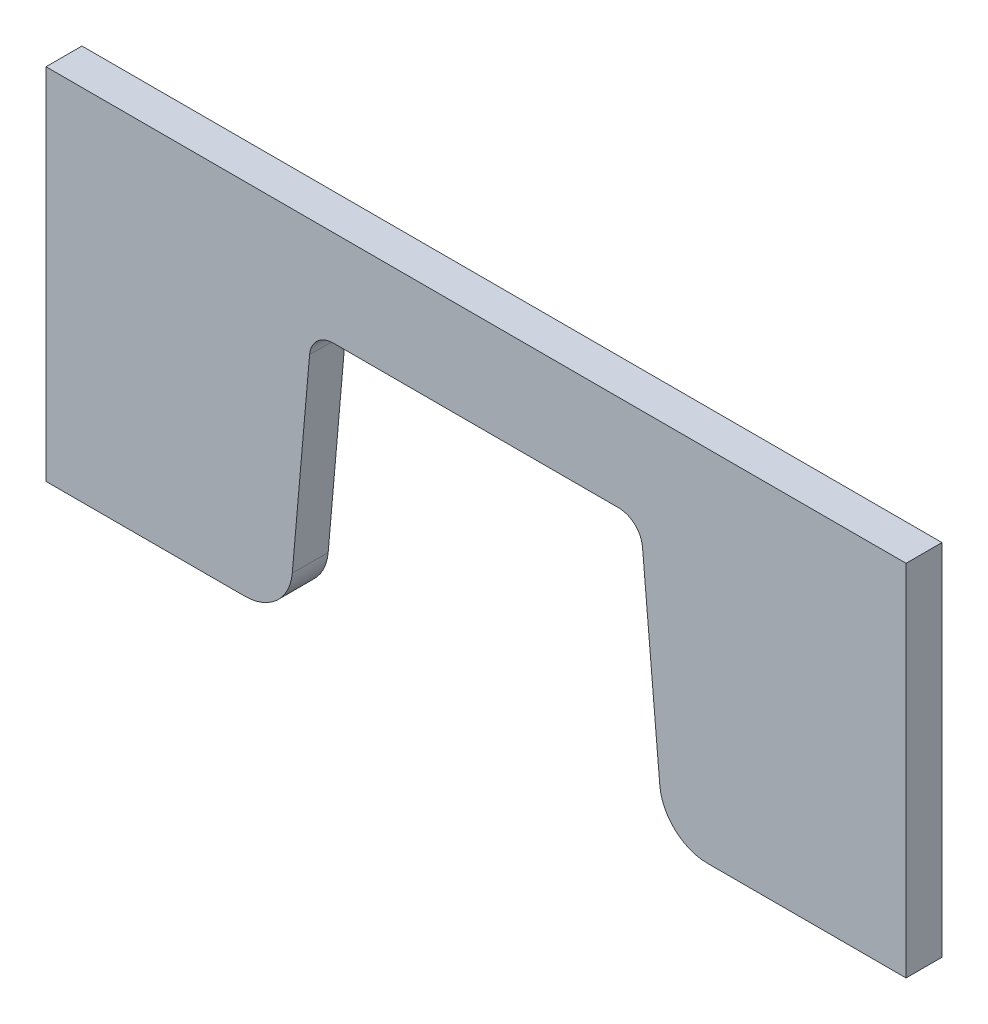
ISO-10303-21;
HEADER;
FILE_DESCRIPTION(('STEP AP214'),'2;1');
FILE_NAME('part.step','',(''),(''),'','','');
FILE_SCHEMA(('AUTOMOTIVE_DESIGN { 1 0 10303 214 1 1 1 1 }'));
ENDSEC;
DATA;
#1=APPLICATION_CONTEXT('core data for automotive mechanical design processes');
#2=APPLICATION_PROTOCOL_DEFINITION('international standard','automotive_design',2000,#1);
#3=PRODUCT_CONTEXT('',#1,'mechanical');
#4=PRODUCT('Part','Part','',(#3));
#5=PRODUCT_RELATED_PRODUCT_CATEGORY('part','',(#4));
#6=PRODUCT_DEFINITION_FORMATION('','',#4);
#7=PRODUCT_DEFINITION_CONTEXT('part definition',#1,'design');
#8=PRODUCT_DEFINITION('design','',#6,#7);
#9=PRODUCT_DEFINITION_SHAPE('','',#8);
#10=(LENGTH_UNIT() NAMED_UNIT(*) SI_UNIT(.MILLI.,.METRE.));
#11=(NAMED_UNIT(*) PLANE_ANGLE_UNIT() SI_UNIT($,.RADIAN.));
#12=(NAMED_UNIT(*) SI_UNIT($,.STERADIAN.) SOLID_ANGLE_UNIT());
#13=UNCERTAINTY_MEASURE_WITH_UNIT(LENGTH_MEASURE(1.E-05),#10,'distance_accuracy_value','');
#14=(GEOMETRIC_REPRESENTATION_CONTEXT(3) GLOBAL_UNCERTAINTY_ASSIGNED_CONTEXT((#13)) GLOBAL_UNIT_ASSIGNED_CONTEXT((#10,
#11,#12)) REPRESENTATION_CONTEXT('',''));
#15=CARTESIAN_POINT('',(0.,0.,0.));
#16=DIRECTION('',(0.,0.,1.));
#17=DIRECTION('',(1.,0.,0.));
#18=AXIS2_PLACEMENT_3D('',#15,#16,#17);
#19=CARTESIAN_POINT('',(-228.088766336441,-273.05,19.05));
#20=DIRECTION('',(1.,0.,0.));
#21=DIRECTION('',(0.,1.,0.));
#22=AXIS2_PLACEMENT_3D('',#19,#20,#21);
#23=PLANE('',#22);
#24=DIRECTION('',(0.,-1.,0.));
#25=VECTOR('',#24,1.);
#26=CARTESIAN_POINT('',(-228.088766336441,-273.05,0.));
#27=LINE('',#26,#25);
#28=CARTESIAN_POINT('',(-228.088766336441,-273.05,0.));
#29=VERTEX_POINT('',#28);
#30=CARTESIAN_POINT('',(-228.088766336441,-463.55,0.));
#31=VERTEX_POINT('',#30);
#32=EDGE_CURVE('E152',#29,#31,#27,.T.);
#33=ORIENTED_EDGE('',*,*,#32,.T.);
#34=DIRECTION('',(0.,0.,-1.));
#35=VECTOR('',#34,1.);
#36=CARTESIAN_POINT('',(-228.088766336441,-463.55,19.05));
#37=LINE('',#36,#35);
#38=CARTESIAN_POINT('',(-228.088766336441,-463.55,19.05));
#39=VERTEX_POINT('',#38);
#40=EDGE_CURVE('E11',#39,#31,#37,.T.);
#41=ORIENTED_EDGE('',*,*,#40,.F.);
#42=DIRECTION('',(0.,-1.,0.));
#43=VECTOR('',#42,1.);
#44=CARTESIAN_POINT('',(-228.088766336441,-273.05,19.05));
#45=LINE('',#44,#43);
#46=CARTESIAN_POINT('',(-228.088766336441,-273.05,19.05));
#47=VERTEX_POINT('',#46);
#48=EDGE_CURVE('E178',#47,#39,#45,.T.);
#49=ORIENTED_EDGE('',*,*,#48,.F.);
#50=DIRECTION('',(0.,0.,-1.));
#51=VECTOR('',#50,1.);
#52=CARTESIAN_POINT('',(-228.088766336441,-273.05,19.05));
#53=LINE('',#52,#51);
#54=EDGE_CURVE('E148',#47,#29,#53,.T.);
#55=ORIENTED_EDGE('',*,*,#54,.T.);
#56=EDGE_LOOP('',(#33,#41,#49,#55));
#57=FACE_BOUND('',#56,.T.);
#58=ADVANCED_FACE('F33',(#57),#23,.F.);
#59=CARTESIAN_POINT('',(-126.488766336441,-463.55,19.05));
#60=DIRECTION('',(0.,1.,0.));
#61=DIRECTION('',(0.,0.,1.));
#62=AXIS2_PLACEMENT_3D('',#59,#60,#61);
#63=PLANE('',#62);
#64=DIRECTION('',(1.,0.,0.));
#65=VECTOR('',#64,1.);
#66=CARTESIAN_POINT('',(-126.488766336441,-463.55,0.));
#67=LINE('',#66,#65);
#68=CARTESIAN_POINT('',(-122.776078156484,-463.55,0.));
#69=VERTEX_POINT('',#68);
#70=EDGE_CURVE('E155',#31,#69,#67,.T.);
#71=ORIENTED_EDGE('',*,*,#70,.T.);
#72=DIRECTION('',(0.,0.,-1.));
#73=VECTOR('',#72,1.);
#74=CARTESIAN_POINT('',(-122.776078156484,-463.55,19.05));
#75=LINE('',#74,#73);
#76=CARTESIAN_POINT('',(-122.776078156484,-463.55,19.05));
#77=VERTEX_POINT('',#76);
#78=EDGE_CURVE('E41',#77,#69,#75,.T.);
#79=ORIENTED_EDGE('',*,*,#78,.F.);
#80=DIRECTION('',(1.,0.,0.));
#81=VECTOR('',#80,1.);
#82=CARTESIAN_POINT('',(-228.088766336441,-463.55,19.05));
#83=LINE('',#82,#81);
#84=EDGE_CURVE('E104',#39,#77,#83,.T.);
#85=ORIENTED_EDGE('',*,*,#84,.F.);
#86=ORIENTED_EDGE('',*,*,#40,.T.);
#87=EDGE_LOOP('',(#71,#79,#85,#86));
#88=FACE_BOUND('',#87,.T.);
#89=ADVANCED_FACE('F205',(#88),#63,.F.);
#90=CARTESIAN_POINT('',(-122.776078156484,-438.15,19.05));
#91=DIRECTION('',(0.,0.,-1.));
#92=DIRECTION('',(-1.,0.,0.));
#93=AXIS2_PLACEMENT_3D('',#90,#91,#92);
#94=CYLINDRICAL_SURFACE('',#93,25.4);
#95=CARTESIAN_POINT('',(-122.776078156484,-438.15,0.));
#96=DIRECTION('',(0.,0.,1.));
#97=DIRECTION('',(1.,0.,0.));
#98=AXIS2_PLACEMENT_3D('',#95,#96,#97);
#99=CIRCLE('',#98,25.4);
#100=CARTESIAN_POINT('',(-97.4727328249532,-440.363755865791,0.));
#101=VERTEX_POINT('',#100);
#102=EDGE_CURVE('E158',#69,#101,#99,.T.);
#103=ORIENTED_EDGE('',*,*,#102,.T.);
#104=DIRECTION('',(0.,0.,-1.));
#105=VECTOR('',#104,1.);
#106=CARTESIAN_POINT('',(-97.4727328249532,-440.363755865791,19.05));
#107=LINE('',#106,#105);
#108=CARTESIAN_POINT('',(-97.4727328249532,-440.363755865791,19.05));
#109=VERTEX_POINT('',#108);
#110=EDGE_CURVE('E197',#109,#101,#107,.T.);
#111=ORIENTED_EDGE('',*,*,#110,.F.);
#112=CARTESIAN_POINT('',(-122.776078156484,-438.15,19.05));
#113=DIRECTION('',(0.,0.,1.));
#114=DIRECTION('',(1.,0.,0.));
#115=AXIS2_PLACEMENT_3D('',#112,#113,#114);
#116=CIRCLE('',#115,25.4);
#117=EDGE_CURVE('E204',#77,#109,#116,.T.);
#118=ORIENTED_EDGE('',*,*,#117,.F.);
#119=ORIENTED_EDGE('',*,*,#78,.T.);
#120=EDGE_LOOP('',(#103,#111,#118,#119));
#121=FACE_BOUND('',#120,.T.);
#122=ADVANCED_FACE('F202',(#121),#94,.T.);
#123=CARTESIAN_POINT('',(-97.4727328249532,-440.363755865791,19.05));
#124=DIRECTION('',(-0.996194698091746,0.0871557427476581,0.));
#125=DIRECTION('',(-0.0871557427476581,-0.996194698091746,0.));
#126=AXIS2_PLACEMENT_3D('',#123,#124,#125);
#127=PLANE('',#126);
#128=DIRECTION('',(0.087155742747658,0.996194698091745,0.));
#129=VECTOR('',#128,1.);
#130=CARTESIAN_POINT('',(-97.4727328249532,-440.363755865791,0.));
#131=LINE('',#130,#129);
#132=CARTESIAN_POINT('',(-88.2891387037293,-335.39479473287,0.));
#133=VERTEX_POINT('',#132);
#134=EDGE_CURVE('E160',#101,#133,#131,.T.);
#135=ORIENTED_EDGE('',*,*,#134,.T.);
#136=DIRECTION('',(0.,0.,-1.));
#137=VECTOR('',#136,1.);
#138=CARTESIAN_POINT('',(-88.2891387037293,-335.39479473287,19.05));
#139=LINE('',#138,#137);
#140=CARTESIAN_POINT('',(-88.2891387037293,-335.39479473287,19.05));
#141=VERTEX_POINT('',#140);
#142=EDGE_CURVE('E194',#141,#133,#139,.T.);
#143=ORIENTED_EDGE('',*,*,#142,.F.);
#144=DIRECTION('',(0.087155742747658,0.996194698091745,0.));
#145=VECTOR('',#144,1.);
#146=CARTESIAN_POINT('',(-97.4727328249532,-440.363755865791,19.05));
#147=LINE('',#146,#145);
#148=EDGE_CURVE('E223',#109,#141,#147,.T.);
#149=ORIENTED_EDGE('',*,*,#148,.F.);
#150=ORIENTED_EDGE('',*,*,#110,.T.);
#151=EDGE_LOOP('',(#135,#143,#149,#150));
#152=FACE_BOUND('',#151,.T.);
#153=ADVANCED_FACE('F214',(#152),#127,.F.);
#154=CARTESIAN_POINT('',(-75.6374660379641,-336.501672665765,19.05));
#155=DIRECTION('',(0.,0.,-1.));
#156=DIRECTION('',(-1.,0.,0.));
#157=AXIS2_PLACEMENT_3D('',#154,#155,#156);
#158=CYLINDRICAL_SURFACE('',#157,12.7);
#159=CARTESIAN_POINT('',(-75.6374660379641,-336.501672665765,0.));
#160=DIRECTION('',(0.,0.,-1.));
#161=DIRECTION('',(1.,0.,0.));
#162=AXIS2_PLACEMENT_3D('',#159,#160,#161);
#163=CIRCLE('',#162,12.7);
#164=CARTESIAN_POINT('',(-75.6374660379641,-323.801672665765,0.));
#165=VERTEX_POINT('',#164);
#166=EDGE_CURVE('E162',#133,#165,#163,.T.);
#167=ORIENTED_EDGE('',*,*,#166,.T.);
#168=DIRECTION('',(0.,0.,-1.));
#169=VECTOR('',#168,1.);
#170=CARTESIAN_POINT('',(-75.6374660379641,-323.801672665765,19.05));
#171=LINE('',#170,#169);
#172=CARTESIAN_POINT('',(-75.6374660379641,-323.801672665765,19.05));
#173=VERTEX_POINT('',#172);
#174=EDGE_CURVE('E191',#173,#165,#171,.T.);
#175=ORIENTED_EDGE('',*,*,#174,.F.);
#176=CARTESIAN_POINT('',(-75.6374660379641,-336.501672665765,19.05));
#177=DIRECTION('',(0.,0.,-1.));
#178=DIRECTION('',(1.,0.,0.));
#179=AXIS2_PLACEMENT_3D('',#176,#177,#178);
#180=CIRCLE('',#179,12.7);
#181=EDGE_CURVE('E220',#141,#173,#180,.T.);
#182=ORIENTED_EDGE('',*,*,#181,.F.);
#183=ORIENTED_EDGE('',*,*,#142,.T.);
#184=EDGE_LOOP('',(#167,#175,#182,#183));
#185=FACE_BOUND('',#184,.T.);
#186=ADVANCED_FACE('F218',(#185),#158,.F.);
#187=CARTESIAN_POINT('',(61.8748719479854,-323.801672665765,19.05));
#188=DIRECTION('',(0.,1.,0.));
#189=DIRECTION('',(0.,0.,1.));
#190=AXIS2_PLACEMENT_3D('',#187,#188,#189);
#191=PLANE('',#190);
#192=DIRECTION('',(1.,0.,0.));
#193=VECTOR('',#192,1.);
#194=CARTESIAN_POINT('',(61.8748719479854,-323.801672665765,0.));
#195=LINE('',#194,#193);
#196=CARTESIAN_POINT('',(75.6374660379641,-323.801672665765,0.));
#197=VERTEX_POINT('',#196);
#198=EDGE_CURVE('E165',#165,#197,#195,.T.);
#199=ORIENTED_EDGE('',*,*,#198,.T.);
#200=DIRECTION('',(0.,0.,-1.));
#201=VECTOR('',#200,1.);
#202=CARTESIAN_POINT('',(75.6374660379641,-323.801672665765,19.05));
#203=LINE('',#202,#201);
#204=CARTESIAN_POINT('',(75.6374660379641,-323.801672665765,19.05));
#205=VERTEX_POINT('',#204);
#206=EDGE_CURVE('E188',#205,#197,#203,.T.);
#207=ORIENTED_EDGE('',*,*,#206,.F.);
#208=DIRECTION('',(1.,0.,0.));
#209=VECTOR('',#208,1.);
#210=CARTESIAN_POINT('',(-61.8748719479854,-323.801672665765,19.05));
#211=LINE('',#210,#209);
#212=EDGE_CURVE('E222',#173,#205,#211,.T.);
#213=ORIENTED_EDGE('',*,*,#212,.F.);
#214=ORIENTED_EDGE('',*,*,#174,.T.);
#215=EDGE_LOOP('',(#199,#207,#213,#214));
#216=FACE_BOUND('',#215,.T.);
#217=ADVANCED_FACE('F246',(#216),#191,.F.);
#218=CARTESIAN_POINT('',(75.6374660379641,-336.501672665765,19.05));
#219=DIRECTION('',(0.,0.,-1.));
#220=DIRECTION('',(-1.,0.,0.));
#221=AXIS2_PLACEMENT_3D('',#218,#219,#220);
#222=CYLINDRICAL_SURFACE('',#221,12.7);
#223=CARTESIAN_POINT('',(75.6374660379641,-336.501672665765,0.));
#224=DIRECTION('',(0.,0.,-1.));
#225=DIRECTION('',(1.,0.,0.));
#226=AXIS2_PLACEMENT_3D('',#223,#224,#225);
#227=CIRCLE('',#226,12.7);
#228=CARTESIAN_POINT('',(88.2891387037293,-335.39479473287,0.));
#229=VERTEX_POINT('',#228);
#230=EDGE_CURVE('E167',#197,#229,#227,.T.);
#231=ORIENTED_EDGE('',*,*,#230,.T.);
#232=DIRECTION('',(0.,0.,-1.));
#233=VECTOR('',#232,1.);
#234=CARTESIAN_POINT('',(88.2891387037293,-335.39479473287,19.05));
#235=LINE('',#234,#233);
#236=CARTESIAN_POINT('',(88.2891387037293,-335.39479473287,19.05));
#237=VERTEX_POINT('',#236);
#238=EDGE_CURVE('E185',#237,#229,#235,.T.);
#239=ORIENTED_EDGE('',*,*,#238,.F.);
#240=CARTESIAN_POINT('',(75.6374660379641,-336.501672665765,19.05));
#241=DIRECTION('',(0.,0.,-1.));
#242=DIRECTION('',(1.,0.,0.));
#243=AXIS2_PLACEMENT_3D('',#240,#241,#242);
#244=CIRCLE('',#243,12.7);
#245=EDGE_CURVE('E225',#205,#237,#244,.T.);
#246=ORIENTED_EDGE('',*,*,#245,.F.);
#247=ORIENTED_EDGE('',*,*,#206,.T.);
#248=EDGE_LOOP('',(#231,#239,#246,#247));
#249=FACE_BOUND('',#248,.T.);
#250=ADVANCED_FACE('F243',(#249),#222,.F.);
#251=CARTESIAN_POINT('',(97.4727328249532,-440.363755865791,19.05));
#252=DIRECTION('',(0.996194698091746,0.0871557427476581,0.));
#253=DIRECTION('',(-0.0871557427476581,0.996194698091746,0.));
#254=AXIS2_PLACEMENT_3D('',#251,#252,#253);
#255=PLANE('',#254);
#256=DIRECTION('',(0.087155742747658,-0.996194698091745,0.));
#257=VECTOR('',#256,1.);
#258=CARTESIAN_POINT('',(97.4727328249532,-440.363755865791,0.));
#259=LINE('',#258,#257);
#260=CARTESIAN_POINT('',(97.4727328249532,-440.363755865791,0.));
#261=VERTEX_POINT('',#260);
#262=EDGE_CURVE('E169',#229,#261,#259,.T.);
#263=ORIENTED_EDGE('',*,*,#262,.T.);
#264=DIRECTION('',(0.,0.,-1.));
#265=VECTOR('',#264,1.);
#266=CARTESIAN_POINT('',(97.4727328249532,-440.363755865791,19.05));
#267=LINE('',#266,#265);
#268=CARTESIAN_POINT('',(97.4727328249532,-440.363755865791,19.05));
#269=VERTEX_POINT('',#268);
#270=EDGE_CURVE('E182',#269,#261,#267,.T.);
#271=ORIENTED_EDGE('',*,*,#270,.F.);
#272=DIRECTION('',(0.087155742747658,-0.996194698091745,0.));
#273=VECTOR('',#272,1.);
#274=CARTESIAN_POINT('',(97.4727328249532,-440.363755865791,19.05));
#275=LINE('',#274,#273);
#276=EDGE_CURVE('E231',#237,#269,#275,.T.);
#277=ORIENTED_EDGE('',*,*,#276,.F.);
#278=ORIENTED_EDGE('',*,*,#238,.T.);
#279=EDGE_LOOP('',(#263,#271,#277,#278));
#280=FACE_BOUND('',#279,.T.);
#281=ADVANCED_FACE('F237',(#280),#255,.F.);
#282=CARTESIAN_POINT('',(122.776078156484,-438.15,19.05));
#283=DIRECTION('',(0.,0.,-1.));
#284=DIRECTION('',(-1.,0.,0.));
#285=AXIS2_PLACEMENT_3D('',#282,#283,#284);
#286=CYLINDRICAL_SURFACE('',#285,25.4);
#287=CARTESIAN_POINT('',(122.776078156484,-438.15,0.));
#288=DIRECTION('',(0.,0.,1.));
#289=DIRECTION('',(1.,0.,0.));
#290=AXIS2_PLACEMENT_3D('',#287,#288,#289);
#291=CIRCLE('',#290,25.4);
#292=CARTESIAN_POINT('',(122.776078156484,-463.55,0.));
#293=VERTEX_POINT('',#292);
#294=EDGE_CURVE('E172',#261,#293,#291,.T.);
#295=ORIENTED_EDGE('',*,*,#294,.T.);
#296=DIRECTION('',(0.,0.,-1.));
#297=VECTOR('',#296,1.);
#298=CARTESIAN_POINT('',(122.776078156484,-463.55,19.05));
#299=LINE('',#298,#297);
#300=CARTESIAN_POINT('',(122.776078156484,-463.55,19.05));
#301=VERTEX_POINT('',#300);
#302=EDGE_CURVE('E143',#301,#293,#299,.T.);
#303=ORIENTED_EDGE('',*,*,#302,.F.);
#304=CARTESIAN_POINT('',(122.776078156484,-438.15,19.05));
#305=DIRECTION('',(0.,0.,1.));
#306=DIRECTION('',(1.,0.,0.));
#307=AXIS2_PLACEMENT_3D('',#304,#305,#306);
#308=CIRCLE('',#307,25.4);
#309=EDGE_CURVE('E135',#269,#301,#308,.T.);
#310=ORIENTED_EDGE('',*,*,#309,.F.);
#311=ORIENTED_EDGE('',*,*,#270,.T.);
#312=EDGE_LOOP('',(#295,#303,#310,#311));
#313=FACE_BOUND('',#312,.T.);
#314=ADVANCED_FACE('F240',(#313),#286,.T.);
#315=CARTESIAN_POINT('',(228.088766336441,-463.55,19.05));
#316=DIRECTION('',(0.,1.,0.));
#317=DIRECTION('',(0.,0.,1.));
#318=AXIS2_PLACEMENT_3D('',#315,#316,#317);
#319=PLANE('',#318);
#320=DIRECTION('',(1.,0.,0.));
#321=VECTOR('',#320,1.);
#322=CARTESIAN_POINT('',(228.088766336441,-463.55,0.));
#323=LINE('',#322,#321);
#324=CARTESIAN_POINT('',(228.088766336441,-463.55,0.));
#325=VERTEX_POINT('',#324);
#326=EDGE_CURVE('E142',#293,#325,#323,.T.);
#327=ORIENTED_EDGE('',*,*,#326,.T.);
#328=DIRECTION('',(0.,0.,-1.));
#329=VECTOR('',#328,1.);
#330=CARTESIAN_POINT('',(228.088766336441,-463.55,19.05));
#331=LINE('',#330,#329);
#332=CARTESIAN_POINT('',(228.088766336441,-463.55,19.05));
#333=VERTEX_POINT('',#332);
#334=EDGE_CURVE('E140',#333,#325,#331,.T.);
#335=ORIENTED_EDGE('',*,*,#334,.F.);
#336=DIRECTION('',(1.,0.,0.));
#337=VECTOR('',#336,1.);
#338=CARTESIAN_POINT('',(126.488766336441,-463.55,19.05));
#339=LINE('',#338,#337);
#340=EDGE_CURVE('E129',#301,#333,#339,.T.);
#341=ORIENTED_EDGE('',*,*,#340,.F.);
#342=ORIENTED_EDGE('',*,*,#302,.T.);
#343=EDGE_LOOP('',(#327,#335,#341,#342));
#344=FACE_BOUND('',#343,.T.);
#345=ADVANCED_FACE('F141',(#344),#319,.F.);
#346=CARTESIAN_POINT('',(228.088766336441,-463.55,19.05));
#347=DIRECTION('',(-1.,0.,0.));
#348=DIRECTION('',(0.,-1.,0.));
#349=AXIS2_PLACEMENT_3D('',#346,#347,#348);
#350=PLANE('',#349);
#351=DIRECTION('',(0.,1.,0.));
#352=VECTOR('',#351,1.);
#353=CARTESIAN_POINT('',(228.088766336441,-463.55,0.));
#354=LINE('',#353,#352);
#355=CARTESIAN_POINT('',(228.088766336441,-273.05,0.));
#356=VERTEX_POINT('',#355);
#357=EDGE_CURVE('E90',#325,#356,#354,.T.);
#358=ORIENTED_EDGE('',*,*,#357,.T.);
#359=DIRECTION('',(0.,0.,-1.));
#360=VECTOR('',#359,1.);
#361=CARTESIAN_POINT('',(228.088766336441,-273.05,19.05));
#362=LINE('',#361,#360);
#363=CARTESIAN_POINT('',(228.088766336441,-273.05,19.05));
#364=VERTEX_POINT('',#363);
#365=EDGE_CURVE('E144',#364,#356,#362,.T.);
#366=ORIENTED_EDGE('',*,*,#365,.F.);
#367=DIRECTION('',(0.,1.,0.));
#368=VECTOR('',#367,1.);
#369=CARTESIAN_POINT('',(228.088766336441,-463.55,19.05));
#370=LINE('',#369,#368);
#371=EDGE_CURVE('E133',#333,#364,#370,.T.);
#372=ORIENTED_EDGE('',*,*,#371,.F.);
#373=ORIENTED_EDGE('',*,*,#334,.T.);
#374=EDGE_LOOP('',(#358,#366,#372,#373));
#375=FACE_BOUND('',#374,.T.);
#376=ADVANCED_FACE('F146',(#375),#350,.F.);
#377=CARTESIAN_POINT('',(228.088766336441,-273.05,19.05));
#378=DIRECTION('',(0.,-1.,0.));
#379=DIRECTION('',(1.,0.,0.));
#380=AXIS2_PLACEMENT_3D('',#377,#378,#379);
#381=PLANE('',#380);
#382=DIRECTION('',(-1.,0.,0.));
#383=VECTOR('',#382,1.);
#384=CARTESIAN_POINT('',(228.088766336441,-273.05,0.));
#385=LINE('',#384,#383);
#386=EDGE_CURVE('E96',#356,#29,#385,.T.);
#387=ORIENTED_EDGE('',*,*,#386,.T.);
#388=ORIENTED_EDGE('',*,*,#54,.F.);
#389=DIRECTION('',(-1.,0.,0.));
#390=VECTOR('',#389,1.);
#391=CARTESIAN_POINT('',(228.088766336441,-273.05,19.05));
#392=LINE('',#391,#390);
#393=EDGE_CURVE('E49',#364,#47,#392,.T.);
#394=ORIENTED_EDGE('',*,*,#393,.F.);
#395=ORIENTED_EDGE('',*,*,#365,.T.);
#396=EDGE_LOOP('',(#387,#388,#394,#395));
#397=FACE_BOUND('',#396,.T.);
#398=ADVANCED_FACE('F261',(#397),#381,.F.);
#399=CARTESIAN_POINT('',(-122.776078156484,-438.15,19.05));
#400=DIRECTION('',(0.,0.,1.));
#401=DIRECTION('',(1.,0.,0.));
#402=AXIS2_PLACEMENT_3D('',#399,#400,#401);
#403=PLANE('',#402);
#404=ORIENTED_EDGE('',*,*,#48,.T.);
#405=ORIENTED_EDGE('',*,*,#84,.T.);
#406=ORIENTED_EDGE('',*,*,#117,.T.);
#407=ORIENTED_EDGE('',*,*,#148,.T.);
#408=ORIENTED_EDGE('',*,*,#181,.T.);
#409=ORIENTED_EDGE('',*,*,#212,.T.);
#410=ORIENTED_EDGE('',*,*,#245,.T.);
#411=ORIENTED_EDGE('',*,*,#276,.T.);
#412=ORIENTED_EDGE('',*,*,#309,.T.);
#413=ORIENTED_EDGE('',*,*,#340,.T.);
#414=ORIENTED_EDGE('',*,*,#371,.T.);
#415=ORIENTED_EDGE('',*,*,#393,.T.);
#416=EDGE_LOOP('',(#404,#405,#406,#407,#408,#409,#410,#411,#412,#413,#414,#415));
#417=FACE_BOUND('',#416,.T.);
#418=ADVANCED_FACE('F131',(#417),#403,.T.);
#419=CARTESIAN_POINT('',(-122.776078156484,-438.15,0.));
#420=DIRECTION('',(0.,0.,1.));
#421=DIRECTION('',(1.,0.,0.));
#422=AXIS2_PLACEMENT_3D('',#419,#420,#421);
#423=PLANE('',#422);
#424=ORIENTED_EDGE('',*,*,#32,.F.);
#425=ORIENTED_EDGE('',*,*,#386,.F.);
#426=ORIENTED_EDGE('',*,*,#357,.F.);
#427=ORIENTED_EDGE('',*,*,#326,.F.);
#428=ORIENTED_EDGE('',*,*,#294,.F.);
#429=ORIENTED_EDGE('',*,*,#262,.F.);
#430=ORIENTED_EDGE('',*,*,#230,.F.);
#431=ORIENTED_EDGE('',*,*,#198,.F.);
#432=ORIENTED_EDGE('',*,*,#166,.F.);
#433=ORIENTED_EDGE('',*,*,#134,.F.);
#434=ORIENTED_EDGE('',*,*,#102,.F.);
#435=ORIENTED_EDGE('',*,*,#70,.F.);
#436=EDGE_LOOP('',(#424,#425,#426,#427,#428,#429,#430,#431,#432,#433,#434,#435));
#437=FACE_BOUND('',#436,.T.);
#438=ADVANCED_FACE('F209',(#437),#423,.F.);
#439=CLOSED_SHELL('',(#58,#89,#122,#153,#186,#217,#250,#281,#314,#345,#376,#398,#418,#438));
#440=MANIFOLD_SOLID_BREP('B2',#439);
#441=ADVANCED_BREP_SHAPE_REPRESENTATION('',(#18,#440),#14);
#442=SHAPE_DEFINITION_REPRESENTATION(#9,#441);
ENDSEC;
END-ISO-10303-21;
